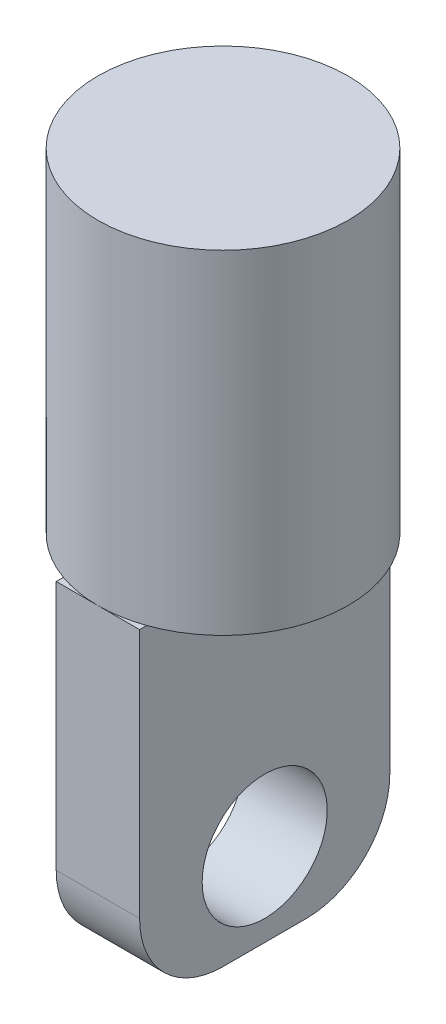
ISO-10303-21;
HEADER;
FILE_DESCRIPTION(('STEP AP214'),'2;1');
FILE_NAME('part.step','',(''),(''),'','','');
FILE_SCHEMA(('AUTOMOTIVE_DESIGN { 1 0 10303 214 1 1 1 1 }'));
ENDSEC;
DATA;
#1=APPLICATION_CONTEXT('core data for automotive mechanical design processes');
#2=APPLICATION_PROTOCOL_DEFINITION('international standard','automotive_design',2000,#1);
#3=PRODUCT_CONTEXT('',#1,'mechanical');
#4=PRODUCT('Part','Part','',(#3));
#5=PRODUCT_RELATED_PRODUCT_CATEGORY('part','',(#4));
#6=PRODUCT_DEFINITION_FORMATION('','',#4);
#7=PRODUCT_DEFINITION_CONTEXT('part definition',#1,'design');
#8=PRODUCT_DEFINITION('design','',#6,#7);
#9=PRODUCT_DEFINITION_SHAPE('','',#8);
#10=(LENGTH_UNIT() NAMED_UNIT(*) SI_UNIT(.MILLI.,.METRE.));
#11=(NAMED_UNIT(*) PLANE_ANGLE_UNIT() SI_UNIT($,.RADIAN.));
#12=(NAMED_UNIT(*) SI_UNIT($,.STERADIAN.) SOLID_ANGLE_UNIT());
#13=UNCERTAINTY_MEASURE_WITH_UNIT(LENGTH_MEASURE(1.E-05),#10,'distance_accuracy_value','');
#14=(GEOMETRIC_REPRESENTATION_CONTEXT(3) GLOBAL_UNCERTAINTY_ASSIGNED_CONTEXT((#13)) GLOBAL_UNIT_ASSIGNED_CONTEXT((#10,
#11,#12)) REPRESENTATION_CONTEXT('',''));
#15=CARTESIAN_POINT('',(0.,0.,0.));
#16=DIRECTION('',(0.,0.,1.));
#17=DIRECTION('',(1.,0.,0.));
#18=AXIS2_PLACEMENT_3D('',#15,#16,#17);
#19=CARTESIAN_POINT('',(0.,0.,0.));
#20=DIRECTION('',(0.,1.,0.));
#21=DIRECTION('',(0.,0.,1.));
#22=AXIS2_PLACEMENT_3D('',#19,#20,#21);
#23=PLANE('',#22);
#24=DIRECTION('',(0.,0.,1.));
#25=VECTOR('',#24,1.);
#26=CARTESIAN_POINT('',(5.,0.,15.));
#27=LINE('',#26,#25);
#28=CARTESIAN_POINT('',(5.,0.,-14.142135623731));
#29=VERTEX_POINT('',#28);
#30=CARTESIAN_POINT('',(5.,0.,14.142135623731));
#31=VERTEX_POINT('',#30);
#32=EDGE_CURVE('E122',#29,#31,#27,.T.);
#33=ORIENTED_EDGE('',*,*,#32,.F.);
#34=CARTESIAN_POINT('',(0.,0.,0.));
#35=DIRECTION('',(0.,1.,0.));
#36=DIRECTION('',(0.,0.,1.));
#37=AXIS2_PLACEMENT_3D('',#34,#35,#36);
#38=CIRCLE('',#37,15.);
#39=EDGE_CURVE('E157',#31,#29,#38,.T.);
#40=ORIENTED_EDGE('',*,*,#39,.F.);
#41=EDGE_LOOP('',(#33,#40));
#42=FACE_BOUND('',#41,.T.);
#43=ADVANCED_FACE('F33',(#42),#23,.F.);
#44=DIRECTION('',(0.,0.,-1.));
#45=VECTOR('',#44,1.);
#46=CARTESIAN_POINT('',(-5.,0.,15.));
#47=LINE('',#46,#45);
#48=CARTESIAN_POINT('',(-5.,0.,14.142135623731));
#49=VERTEX_POINT('',#48);
#50=CARTESIAN_POINT('',(-5.,0.,-14.1421356237309));
#51=VERTEX_POINT('',#50);
#52=EDGE_CURVE('E138',#49,#51,#47,.T.);
#53=ORIENTED_EDGE('',*,*,#52,.F.);
#54=EDGE_CURVE('E195',#51,#49,#38,.T.);
#55=ORIENTED_EDGE('',*,*,#54,.F.);
#56=EDGE_LOOP('',(#53,#55));
#57=FACE_BOUND('',#56,.T.);
#58=ADVANCED_FACE('F194',(#57),#23,.F.);
#59=CARTESIAN_POINT('',(0.,40.,0.));
#60=DIRECTION('',(0.,-1.,0.));
#61=DIRECTION('',(0.,0.,-1.));
#62=AXIS2_PLACEMENT_3D('',#59,#60,#61);
#63=CYLINDRICAL_SURFACE('',#62,15.);
#64=CARTESIAN_POINT('',(0.,40.,0.));
#65=DIRECTION('',(0.,1.,0.));
#66=DIRECTION('',(0.,0.,1.));
#67=AXIS2_PLACEMENT_3D('',#64,#65,#66);
#68=CIRCLE('',#67,15.);
#69=CARTESIAN_POINT('',(0.,40.,15.));
#70=VERTEX_POINT('',#69);
#71=EDGE_CURVE('E153',#70,#70,#68,.T.);
#72=ORIENTED_EDGE('',*,*,#71,.F.);
#73=EDGE_LOOP('',(#72));
#74=FACE_BOUND('',#73,.T.);
#75=CARTESIAN_POINT('',(0.,0.,15.));
#76=VERTEX_POINT('',#75);
#77=EDGE_CURVE('E130',#76,#31,#38,.T.);
#78=ORIENTED_EDGE('',*,*,#77,.T.);
#79=ORIENTED_EDGE('',*,*,#39,.T.);
#80=CARTESIAN_POINT('',(0.,0.,-15.));
#81=VERTEX_POINT('',#80);
#82=EDGE_CURVE('E187',#29,#81,#38,.T.);
#83=ORIENTED_EDGE('',*,*,#82,.T.);
#84=EDGE_CURVE('E200',#81,#51,#38,.T.);
#85=ORIENTED_EDGE('',*,*,#84,.T.);
#86=ORIENTED_EDGE('',*,*,#54,.T.);
#87=EDGE_CURVE('E113',#49,#76,#38,.T.);
#88=ORIENTED_EDGE('',*,*,#87,.T.);
#89=EDGE_LOOP('',(#78,#79,#83,#85,#86,#88));
#90=FACE_BOUND('',#89,.T.);
#91=ADVANCED_FACE('F198',(#74,#90),#63,.T.);
#92=CARTESIAN_POINT('',(0.,40.,0.));
#93=DIRECTION('',(0.,1.,0.));
#94=DIRECTION('',(0.,0.,1.));
#95=AXIS2_PLACEMENT_3D('',#92,#93,#94);
#96=PLANE('',#95);
#97=ORIENTED_EDGE('',*,*,#71,.T.);
#98=EDGE_LOOP('',(#97));
#99=FACE_BOUND('',#98,.T.);
#100=ADVANCED_FACE('F231',(#99),#96,.T.);
#101=CARTESIAN_POINT('',(0.,0.,0.));
#102=DIRECTION('',(0.,-1.,0.));
#103=DIRECTION('',(0.,0.,-1.));
#104=AXIS2_PLACEMENT_3D('',#101,#102,#103);
#105=PLANE('',#104);
#106=ORIENTED_EDGE('',*,*,#82,.F.);
#107=CARTESIAN_POINT('',(5.,0.,-15.));
#108=VERTEX_POINT('',#107);
#109=EDGE_CURVE('E125',#108,#29,#27,.T.);
#110=ORIENTED_EDGE('',*,*,#109,.F.);
#111=DIRECTION('',(1.,0.,0.));
#112=VECTOR('',#111,1.);
#113=CARTESIAN_POINT('',(-5.,0.,-15.));
#114=LINE('',#113,#112);
#115=EDGE_CURVE('E142',#81,#108,#114,.T.);
#116=ORIENTED_EDGE('',*,*,#115,.F.);
#117=EDGE_LOOP('',(#106,#110,#116));
#118=FACE_BOUND('',#117,.T.);
#119=ADVANCED_FACE('F186',(#118),#105,.F.);
#120=ORIENTED_EDGE('',*,*,#84,.F.);
#121=CARTESIAN_POINT('',(-5.,0.,-15.));
#122=VERTEX_POINT('',#121);
#123=EDGE_CURVE('E143',#122,#81,#114,.T.);
#124=ORIENTED_EDGE('',*,*,#123,.F.);
#125=EDGE_CURVE('E132',#51,#122,#47,.T.);
#126=ORIENTED_EDGE('',*,*,#125,.F.);
#127=EDGE_LOOP('',(#120,#124,#126));
#128=FACE_BOUND('',#127,.T.);
#129=ADVANCED_FACE('F295',(#128),#105,.F.);
#130=ORIENTED_EDGE('',*,*,#77,.F.);
#131=DIRECTION('',(-1.,0.,0.));
#132=VECTOR('',#131,1.);
#133=CARTESIAN_POINT('',(-5.,0.,15.));
#134=LINE('',#133,#132);
#135=CARTESIAN_POINT('',(5.,0.,15.));
#136=VERTEX_POINT('',#135);
#137=EDGE_CURVE('E109',#136,#76,#134,.T.);
#138=ORIENTED_EDGE('',*,*,#137,.F.);
#139=EDGE_CURVE('E118',#31,#136,#27,.T.);
#140=ORIENTED_EDGE('',*,*,#139,.F.);
#141=EDGE_LOOP('',(#130,#138,#140));
#142=FACE_BOUND('',#141,.T.);
#143=ADVANCED_FACE('F128',(#142),#105,.F.);
#144=CARTESIAN_POINT('',(5.,-40.,15.));
#145=DIRECTION('',(-1.,0.,0.));
#146=DIRECTION('',(0.,0.,1.));
#147=AXIS2_PLACEMENT_3D('',#144,#145,#146);
#148=PLANE('',#147);
#149=CARTESIAN_POINT('',(5.,-30.,0.));
#150=DIRECTION('',(-1.,0.,0.));
#151=DIRECTION('',(0.,0.,1.));
#152=AXIS2_PLACEMENT_3D('',#149,#150,#151);
#153=CIRCLE('',#152,7.5);
#154=CARTESIAN_POINT('',(5.,-30.,7.5));
#155=VERTEX_POINT('',#154);
#156=EDGE_CURVE('E126',#155,#155,#153,.T.);
#157=ORIENTED_EDGE('',*,*,#156,.T.);
#158=EDGE_LOOP('',(#157));
#159=FACE_BOUND('',#158,.T.);
#160=DIRECTION('',(0.,0.,1.));
#161=VECTOR('',#160,1.);
#162=CARTESIAN_POINT('',(5.,-40.,15.));
#163=LINE('',#162,#161);
#164=CARTESIAN_POINT('',(5.,-40.,-5.));
#165=VERTEX_POINT('',#164);
#166=CARTESIAN_POINT('',(5.,-40.,5.));
#167=VERTEX_POINT('',#166);
#168=EDGE_CURVE('E146',#165,#167,#163,.T.);
#169=ORIENTED_EDGE('',*,*,#168,.F.);
#170=CARTESIAN_POINT('',(5.,-30.,-5.));
#171=DIRECTION('',(-1.,0.,0.));
#172=DIRECTION('',(0.,0.,1.));
#173=AXIS2_PLACEMENT_3D('',#170,#171,#172);
#174=CIRCLE('',#173,10.);
#175=CARTESIAN_POINT('',(5.,-30.,-15.));
#176=VERTEX_POINT('',#175);
#177=EDGE_CURVE('E166',#165,#176,#174,.F.);
#178=ORIENTED_EDGE('',*,*,#177,.T.);
#179=DIRECTION('',(0.,1.,0.));
#180=VECTOR('',#179,1.);
#181=CARTESIAN_POINT('',(5.,-40.,-15.));
#182=LINE('',#181,#180);
#183=EDGE_CURVE('E147',#176,#108,#182,.T.);
#184=ORIENTED_EDGE('',*,*,#183,.T.);
#185=ORIENTED_EDGE('',*,*,#109,.T.);
#186=ORIENTED_EDGE('',*,*,#32,.T.);
#187=ORIENTED_EDGE('',*,*,#139,.T.);
#188=DIRECTION('',(0.,1.,0.));
#189=VECTOR('',#188,1.);
#190=CARTESIAN_POINT('',(5.,-40.,15.));
#191=LINE('',#190,#189);
#192=CARTESIAN_POINT('',(5.,-30.,15.));
#193=VERTEX_POINT('',#192);
#194=EDGE_CURVE('E104',#193,#136,#191,.T.);
#195=ORIENTED_EDGE('',*,*,#194,.F.);
#196=CARTESIAN_POINT('',(5.,-30.,5.));
#197=DIRECTION('',(-1.,0.,0.));
#198=DIRECTION('',(0.,0.,1.));
#199=AXIS2_PLACEMENT_3D('',#196,#197,#198);
#200=CIRCLE('',#199,10.);
#201=EDGE_CURVE('E164',#193,#167,#200,.F.);
#202=ORIENTED_EDGE('',*,*,#201,.T.);
#203=EDGE_LOOP('',(#169,#178,#184,#185,#186,#187,#195,#202));
#204=FACE_BOUND('',#203,.T.);
#205=ADVANCED_FACE('F120',(#159,#204),#148,.F.);
#206=CARTESIAN_POINT('',(-5.,-40.,15.));
#207=DIRECTION('',(0.,0.,-1.));
#208=DIRECTION('',(-1.,0.,0.));
#209=AXIS2_PLACEMENT_3D('',#206,#207,#208);
#210=PLANE('',#209);
#211=DIRECTION('',(0.,1.,0.));
#212=VECTOR('',#211,1.);
#213=CARTESIAN_POINT('',(-5.,-40.,15.));
#214=LINE('',#213,#212);
#215=CARTESIAN_POINT('',(-5.,-30.,15.));
#216=VERTEX_POINT('',#215);
#217=CARTESIAN_POINT('',(-5.,0.,15.));
#218=VERTEX_POINT('',#217);
#219=EDGE_CURVE('E114',#216,#218,#214,.T.);
#220=ORIENTED_EDGE('',*,*,#219,.F.);
#221=DIRECTION('',(-1.,0.,0.));
#222=VECTOR('',#221,1.);
#223=CARTESIAN_POINT('',(5.,-30.,15.));
#224=LINE('',#223,#222);
#225=EDGE_CURVE('E11',#216,#193,#224,.F.);
#226=ORIENTED_EDGE('',*,*,#225,.T.);
#227=ORIENTED_EDGE('',*,*,#194,.T.);
#228=ORIENTED_EDGE('',*,*,#137,.T.);
#229=EDGE_CURVE('E133',#76,#218,#134,.T.);
#230=ORIENTED_EDGE('',*,*,#229,.T.);
#231=EDGE_LOOP('',(#220,#226,#227,#228,#230));
#232=FACE_BOUND('',#231,.T.);
#233=ADVANCED_FACE('F106',(#232),#210,.F.);
#234=CARTESIAN_POINT('',(-5.,-40.,15.));
#235=DIRECTION('',(1.,0.,0.));
#236=DIRECTION('',(0.,0.,-1.));
#237=AXIS2_PLACEMENT_3D('',#234,#235,#236);
#238=PLANE('',#237);
#239=CARTESIAN_POINT('',(-5.,-30.,0.));
#240=DIRECTION('',(-1.,0.,0.));
#241=DIRECTION('',(0.,0.,1.));
#242=AXIS2_PLACEMENT_3D('',#239,#240,#241);
#243=CIRCLE('',#242,7.5);
#244=CARTESIAN_POINT('',(-5.,-30.,7.5));
#245=VERTEX_POINT('',#244);
#246=EDGE_CURVE('E208',#245,#245,#243,.T.);
#247=ORIENTED_EDGE('',*,*,#246,.F.);
#248=EDGE_LOOP('',(#247));
#249=FACE_BOUND('',#248,.T.);
#250=DIRECTION('',(0.,1.,0.));
#251=VECTOR('',#250,1.);
#252=CARTESIAN_POINT('',(-5.,-40.,-15.));
#253=LINE('',#252,#251);
#254=CARTESIAN_POINT('',(-5.,-30.,-15.));
#255=VERTEX_POINT('',#254);
#256=EDGE_CURVE('E149',#255,#122,#253,.T.);
#257=ORIENTED_EDGE('',*,*,#256,.F.);
#258=CARTESIAN_POINT('',(-5.,-30.,-5.));
#259=DIRECTION('',(1.,0.,0.));
#260=DIRECTION('',(0.,0.,-1.));
#261=AXIS2_PLACEMENT_3D('',#258,#259,#260);
#262=CIRCLE('',#261,10.);
#263=CARTESIAN_POINT('',(-5.,-40.,-5.));
#264=VERTEX_POINT('',#263);
#265=EDGE_CURVE('E41',#255,#264,#262,.F.);
#266=ORIENTED_EDGE('',*,*,#265,.T.);
#267=DIRECTION('',(0.,0.,-1.));
#268=VECTOR('',#267,1.);
#269=CARTESIAN_POINT('',(-5.,-40.,15.));
#270=LINE('',#269,#268);
#271=CARTESIAN_POINT('',(-5.,-40.,5.));
#272=VERTEX_POINT('',#271);
#273=EDGE_CURVE('E150',#272,#264,#270,.T.);
#274=ORIENTED_EDGE('',*,*,#273,.F.);
#275=CARTESIAN_POINT('',(-5.,-30.,5.));
#276=DIRECTION('',(1.,0.,0.));
#277=DIRECTION('',(0.,0.,-1.));
#278=AXIS2_PLACEMENT_3D('',#275,#276,#277);
#279=CIRCLE('',#278,10.);
#280=EDGE_CURVE('E48',#272,#216,#279,.F.);
#281=ORIENTED_EDGE('',*,*,#280,.T.);
#282=ORIENTED_EDGE('',*,*,#219,.T.);
#283=EDGE_CURVE('E136',#218,#49,#47,.T.);
#284=ORIENTED_EDGE('',*,*,#283,.T.);
#285=ORIENTED_EDGE('',*,*,#52,.T.);
#286=ORIENTED_EDGE('',*,*,#125,.T.);
#287=EDGE_LOOP('',(#257,#266,#274,#281,#282,#284,#285,#286));
#288=FACE_BOUND('',#287,.T.);
#289=ADVANCED_FACE('F171',(#249,#288),#238,.F.);
#290=CARTESIAN_POINT('',(-5.,-40.,-15.));
#291=DIRECTION('',(0.,0.,1.));
#292=DIRECTION('',(1.,0.,0.));
#293=AXIS2_PLACEMENT_3D('',#290,#291,#292);
#294=PLANE('',#293);
#295=ORIENTED_EDGE('',*,*,#183,.F.);
#296=DIRECTION('',(1.,0.,0.));
#297=VECTOR('',#296,1.);
#298=CARTESIAN_POINT('',(-5.,-30.,-15.));
#299=LINE('',#298,#297);
#300=EDGE_CURVE('E56',#176,#255,#299,.F.);
#301=ORIENTED_EDGE('',*,*,#300,.T.);
#302=ORIENTED_EDGE('',*,*,#256,.T.);
#303=ORIENTED_EDGE('',*,*,#123,.T.);
#304=ORIENTED_EDGE('',*,*,#115,.T.);
#305=EDGE_LOOP('',(#295,#301,#302,#303,#304));
#306=FACE_BOUND('',#305,.T.);
#307=ADVANCED_FACE('F180',(#306),#294,.F.);
#308=CARTESIAN_POINT('',(0.,-40.,0.));
#309=DIRECTION('',(0.,-1.,0.));
#310=DIRECTION('',(0.,0.,-1.));
#311=AXIS2_PLACEMENT_3D('',#308,#309,#310);
#312=PLANE('',#311);
#313=ORIENTED_EDGE('',*,*,#273,.T.);
#314=DIRECTION('',(1.,0.,0.));
#315=VECTOR('',#314,1.);
#316=CARTESIAN_POINT('',(5.,-40.,-5.));
#317=LINE('',#316,#315);
#318=EDGE_CURVE('E161',#264,#165,#317,.T.);
#319=ORIENTED_EDGE('',*,*,#318,.T.);
#320=ORIENTED_EDGE('',*,*,#168,.T.);
#321=DIRECTION('',(-1.,0.,0.));
#322=VECTOR('',#321,1.);
#323=CARTESIAN_POINT('',(-5.,-40.,5.));
#324=LINE('',#323,#322);
#325=EDGE_CURVE('E158',#167,#272,#324,.T.);
#326=ORIENTED_EDGE('',*,*,#325,.T.);
#327=EDGE_LOOP('',(#313,#319,#320,#326));
#328=FACE_BOUND('',#327,.T.);
#329=ADVANCED_FACE('F175',(#328),#312,.T.);
#330=ORIENTED_EDGE('',*,*,#87,.F.);
#331=ORIENTED_EDGE('',*,*,#283,.F.);
#332=ORIENTED_EDGE('',*,*,#229,.F.);
#333=EDGE_LOOP('',(#330,#331,#332));
#334=FACE_BOUND('',#333,.T.);
#335=ADVANCED_FACE('F202',(#334),#105,.F.);
#336=CARTESIAN_POINT('',(35.,-30.,0.));
#337=DIRECTION('',(-1.,0.,0.));
#338=DIRECTION('',(0.,0.,1.));
#339=AXIS2_PLACEMENT_3D('',#336,#337,#338);
#340=CYLINDRICAL_SURFACE('',#339,7.5);
#341=ORIENTED_EDGE('',*,*,#246,.T.);
#342=EDGE_LOOP('',(#341));
#343=FACE_BOUND('',#342,.T.);
#344=ORIENTED_EDGE('',*,*,#156,.F.);
#345=EDGE_LOOP('',(#344));
#346=FACE_BOUND('',#345,.T.);
#347=ADVANCED_FACE('F212',(#343,#346),#340,.F.);
#348=CARTESIAN_POINT('',(0.,-30.,-5.));
#349=DIRECTION('',(-1.,0.,0.));
#350=DIRECTION('',(0.,0.,1.));
#351=AXIS2_PLACEMENT_3D('',#348,#349,#350);
#352=CYLINDRICAL_SURFACE('',#351,10.);
#353=ORIENTED_EDGE('',*,*,#265,.F.);
#354=ORIENTED_EDGE('',*,*,#300,.F.);
#355=ORIENTED_EDGE('',*,*,#177,.F.);
#356=ORIENTED_EDGE('',*,*,#318,.F.);
#357=EDGE_LOOP('',(#353,#354,#355,#356));
#358=FACE_BOUND('',#357,.T.);
#359=ADVANCED_FACE('F178',(#358),#352,.T.);
#360=CARTESIAN_POINT('',(0.,-30.,5.));
#361=DIRECTION('',(1.,0.,0.));
#362=DIRECTION('',(0.,0.,-1.));
#363=AXIS2_PLACEMENT_3D('',#360,#361,#362);
#364=CYLINDRICAL_SURFACE('',#363,10.);
#365=ORIENTED_EDGE('',*,*,#201,.F.);
#366=ORIENTED_EDGE('',*,*,#225,.F.);
#367=ORIENTED_EDGE('',*,*,#280,.F.);
#368=ORIENTED_EDGE('',*,*,#325,.F.);
#369=EDGE_LOOP('',(#365,#366,#367,#368));
#370=FACE_BOUND('',#369,.T.);
#371=ADVANCED_FACE('F35',(#370),#364,.T.);
#372=CLOSED_SHELL('',(#43,#58,#91,#100,#119,#129,#143,#205,#233,#289,#307,#329,#335,#347,#359,#371));
#373=MANIFOLD_SOLID_BREP('B2',#372);
#374=ADVANCED_BREP_SHAPE_REPRESENTATION('',(#18,#373),#14);
#375=SHAPE_DEFINITION_REPRESENTATION(#9,#374);
ENDSEC;
END-ISO-10303-21;
